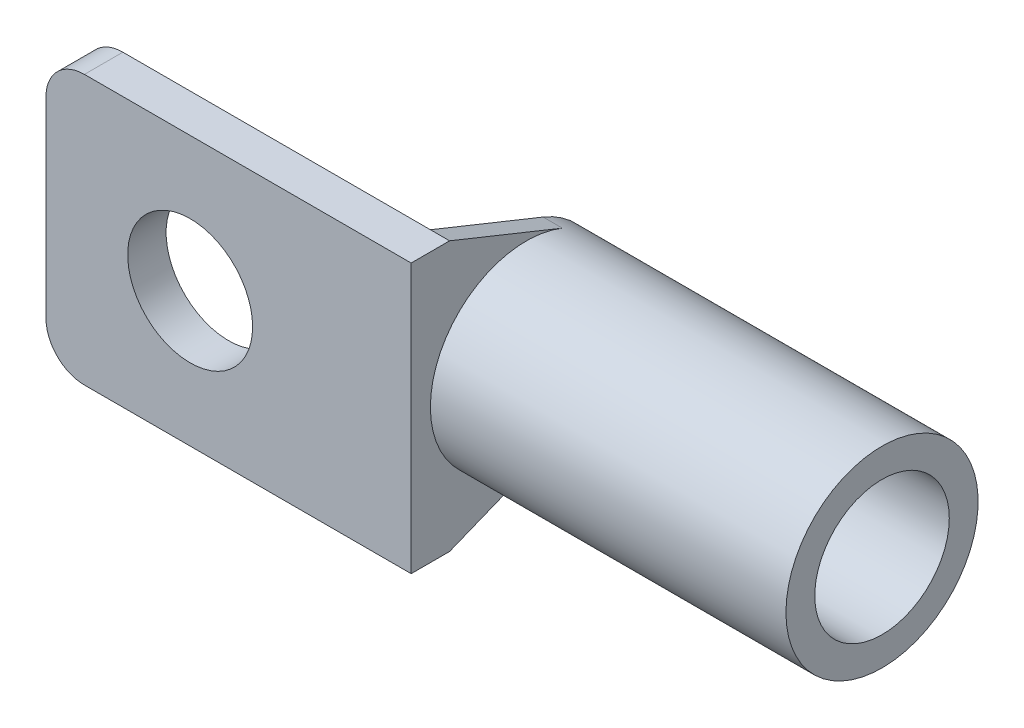
ISO-10303-21;
HEADER;
FILE_DESCRIPTION(('STEP AP214'),'2;1');
FILE_NAME('part.step','',(''),(''),'','','');
FILE_SCHEMA(('AUTOMOTIVE_DESIGN { 1 0 10303 214 1 1 1 1 }'));
ENDSEC;
DATA;
#1=APPLICATION_CONTEXT('core data for automotive mechanical design processes');
#2=APPLICATION_PROTOCOL_DEFINITION('international standard','automotive_design',2000,#1);
#3=PRODUCT_CONTEXT('',#1,'mechanical');
#4=PRODUCT('Part','Part','',(#3));
#5=PRODUCT_RELATED_PRODUCT_CATEGORY('part','',(#4));
#6=PRODUCT_DEFINITION_FORMATION('','',#4);
#7=PRODUCT_DEFINITION_CONTEXT('part definition',#1,'design');
#8=PRODUCT_DEFINITION('design','',#6,#7);
#9=PRODUCT_DEFINITION_SHAPE('','',#8);
#10=(LENGTH_UNIT() NAMED_UNIT(*) SI_UNIT(.MILLI.,.METRE.));
#11=(NAMED_UNIT(*) PLANE_ANGLE_UNIT() SI_UNIT($,.RADIAN.));
#12=(NAMED_UNIT(*) SI_UNIT($,.STERADIAN.) SOLID_ANGLE_UNIT());
#13=UNCERTAINTY_MEASURE_WITH_UNIT(LENGTH_MEASURE(1.E-05),#10,'distance_accuracy_value','');
#14=(GEOMETRIC_REPRESENTATION_CONTEXT(3) GLOBAL_UNCERTAINTY_ASSIGNED_CONTEXT((#13)) GLOBAL_UNIT_ASSIGNED_CONTEXT((#10,
#11,#12)) REPRESENTATION_CONTEXT('',''));
#15=CARTESIAN_POINT('',(0.,0.,0.));
#16=DIRECTION('',(0.,0.,1.));
#17=DIRECTION('',(1.,0.,0.));
#18=AXIS2_PLACEMENT_3D('',#15,#16,#17);
#19=CARTESIAN_POINT('',(0.,0.,-2.));
#20=DIRECTION('',(0.,0.,-1.));
#21=DIRECTION('',(1.,0.,0.));
#22=AXIS2_PLACEMENT_3D('',#19,#20,#21);
#23=PLANE('',#22);
#24=DIRECTION('',(0.,-1.,0.));
#25=VECTOR('',#24,1.);
#26=CARTESIAN_POINT('',(-7.5,7.,-2.));
#27=LINE('',#26,#25);
#28=CARTESIAN_POINT('',(-7.5,5.,-2.));
#29=VERTEX_POINT('',#28);
#30=CARTESIAN_POINT('',(-7.5,-5.,-2.));
#31=VERTEX_POINT('',#30);
#32=EDGE_CURVE('E160',#29,#31,#27,.T.);
#33=ORIENTED_EDGE('',*,*,#32,.F.);
#34=CARTESIAN_POINT('',(-5.5,5.,-2.));
#35=DIRECTION('',(0.,0.,1.));
#36=DIRECTION('',(1.,0.,0.));
#37=AXIS2_PLACEMENT_3D('',#34,#35,#36);
#38=CIRCLE('',#37,2.);
#39=CARTESIAN_POINT('',(-5.5,7.,-2.));
#40=VERTEX_POINT('',#39);
#41=EDGE_CURVE('E214',#40,#29,#38,.T.);
#42=ORIENTED_EDGE('',*,*,#41,.F.);
#43=DIRECTION('',(-1.,0.,0.));
#44=VECTOR('',#43,1.);
#45=CARTESIAN_POINT('',(-7.5,7.,-2.));
#46=LINE('',#45,#44);
#47=CARTESIAN_POINT('',(10.5,7.,-2.));
#48=VERTEX_POINT('',#47);
#49=EDGE_CURVE('E170',#48,#40,#46,.T.);
#50=ORIENTED_EDGE('',*,*,#49,.F.);
#51=DIRECTION('',(-0.680094155203561,-0.733124777959356,0.));
#52=VECTOR('',#51,1.);
#53=CARTESIAN_POINT('',(9.32248316403477,5.73066580221966,-2.));
#54=LINE('',#53,#52);
#55=CARTESIAN_POINT('',(7.5,3.766073760449,-2.));
#56=VERTEX_POINT('',#55);
#57=EDGE_CURVE('E194',#56,#48,#54,.F.);
#58=ORIENTED_EDGE('',*,*,#57,.F.);
#59=DIRECTION('',(0.,1.,0.));
#60=VECTOR('',#59,1.);
#61=CARTESIAN_POINT('',(7.5,7.,-2.));
#62=LINE('',#61,#60);
#63=CARTESIAN_POINT('',(7.5,-3.766073760449,-2.));
#64=VERTEX_POINT('',#63);
#65=EDGE_CURVE('E167',#64,#56,#62,.T.);
#66=ORIENTED_EDGE('',*,*,#65,.F.);
#67=DIRECTION('',(0.680094155203561,-0.733124777959356,0.));
#68=VECTOR('',#67,1.);
#69=CARTESIAN_POINT('',(10.5,-7.,-2.));
#70=LINE('',#69,#68);
#71=CARTESIAN_POINT('',(10.5,-7.,-2.));
#72=VERTEX_POINT('',#71);
#73=EDGE_CURVE('E197',#72,#64,#70,.F.);
#74=ORIENTED_EDGE('',*,*,#73,.F.);
#75=DIRECTION('',(1.,0.,0.));
#76=VECTOR('',#75,1.);
#77=CARTESIAN_POINT('',(-7.5,-7.,-2.));
#78=LINE('',#77,#76);
#79=CARTESIAN_POINT('',(-5.5,-7.,-2.));
#80=VERTEX_POINT('',#79);
#81=EDGE_CURVE('E163',#80,#72,#78,.T.);
#82=ORIENTED_EDGE('',*,*,#81,.F.);
#83=CARTESIAN_POINT('',(-5.5,-5.,-2.));
#84=DIRECTION('',(0.,0.,1.));
#85=DIRECTION('',(1.,0.,0.));
#86=AXIS2_PLACEMENT_3D('',#83,#84,#85);
#87=CIRCLE('',#86,2.);
#88=EDGE_CURVE('E43',#31,#80,#87,.T.);
#89=ORIENTED_EDGE('',*,*,#88,.F.);
#90=EDGE_LOOP('',(#33,#42,#50,#58,#66,#74,#82,#89));
#91=FACE_BOUND('',#90,.T.);
#92=CARTESIAN_POINT('',(0.,0.,-2.));
#93=DIRECTION('',(0.,0.,1.));
#94=DIRECTION('',(1.,0.,0.));
#95=AXIS2_PLACEMENT_3D('',#92,#93,#94);
#96=CIRCLE('',#95,3.25);
#97=CARTESIAN_POINT('',(3.25,0.,-2.));
#98=VERTEX_POINT('',#97);
#99=EDGE_CURVE('E154',#98,#98,#96,.T.);
#100=ORIENTED_EDGE('',*,*,#99,.T.);
#101=EDGE_LOOP('',(#100));
#102=FACE_BOUND('',#101,.T.);
#103=ADVANCED_FACE('F35',(#91,#102),#23,.T.);
#104=CARTESIAN_POINT('',(0.,0.,0.));
#105=DIRECTION('',(0.,0.,-1.));
#106=DIRECTION('',(1.,0.,0.));
#107=AXIS2_PLACEMENT_3D('',#104,#105,#106);
#108=PLANE('',#107);
#109=DIRECTION('',(1.,0.,0.));
#110=VECTOR('',#109,1.);
#111=CARTESIAN_POINT('',(-7.5,-7.,0.));
#112=LINE('',#111,#110);
#113=CARTESIAN_POINT('',(-5.5,-7.,0.));
#114=VERTEX_POINT('',#113);
#115=CARTESIAN_POINT('',(11.5,-7.,0.));
#116=VERTEX_POINT('',#115);
#117=EDGE_CURVE('E175',#114,#116,#112,.T.);
#118=ORIENTED_EDGE('',*,*,#117,.T.);
#119=DIRECTION('',(0.,1.,0.));
#120=VECTOR('',#119,1.);
#121=CARTESIAN_POINT('',(11.5,7.,0.));
#122=LINE('',#121,#120);
#123=CARTESIAN_POINT('',(11.5,7.,0.));
#124=VERTEX_POINT('',#123);
#125=EDGE_CURVE('E233',#116,#124,#122,.T.);
#126=ORIENTED_EDGE('',*,*,#125,.T.);
#127=DIRECTION('',(-1.,0.,0.));
#128=VECTOR('',#127,1.);
#129=CARTESIAN_POINT('',(-7.5,7.,0.));
#130=LINE('',#129,#128);
#131=CARTESIAN_POINT('',(-5.5,7.,0.));
#132=VERTEX_POINT('',#131);
#133=EDGE_CURVE('E164',#124,#132,#130,.T.);
#134=ORIENTED_EDGE('',*,*,#133,.T.);
#135=CARTESIAN_POINT('',(-5.5,5.,0.));
#136=DIRECTION('',(0.,0.,1.));
#137=DIRECTION('',(1.,0.,0.));
#138=AXIS2_PLACEMENT_3D('',#135,#136,#137);
#139=CIRCLE('',#138,2.);
#140=CARTESIAN_POINT('',(-7.5,5.,0.));
#141=VERTEX_POINT('',#140);
#142=EDGE_CURVE('E207',#141,#132,#139,.F.);
#143=ORIENTED_EDGE('',*,*,#142,.F.);
#144=DIRECTION('',(0.,-1.,0.));
#145=VECTOR('',#144,1.);
#146=CARTESIAN_POINT('',(-7.5,7.,0.));
#147=LINE('',#146,#145);
#148=CARTESIAN_POINT('',(-7.5,-5.,0.));
#149=VERTEX_POINT('',#148);
#150=EDGE_CURVE('E157',#141,#149,#147,.T.);
#151=ORIENTED_EDGE('',*,*,#150,.T.);
#152=CARTESIAN_POINT('',(-5.5,-5.,0.));
#153=DIRECTION('',(0.,0.,1.));
#154=DIRECTION('',(1.,0.,0.));
#155=AXIS2_PLACEMENT_3D('',#152,#153,#154);
#156=CIRCLE('',#155,2.);
#157=EDGE_CURVE('E209',#114,#149,#156,.F.);
#158=ORIENTED_EDGE('',*,*,#157,.F.);
#159=EDGE_LOOP('',(#118,#126,#134,#143,#151,#158));
#160=FACE_BOUND('',#159,.T.);
#161=CARTESIAN_POINT('',(0.,0.,0.));
#162=DIRECTION('',(0.,0.,1.));
#163=DIRECTION('',(1.,0.,0.));
#164=AXIS2_PLACEMENT_3D('',#161,#162,#163);
#165=CIRCLE('',#164,3.25);
#166=CARTESIAN_POINT('',(3.25,0.,0.));
#167=VERTEX_POINT('',#166);
#168=EDGE_CURVE('E153',#167,#167,#165,.T.);
#169=ORIENTED_EDGE('',*,*,#168,.F.);
#170=EDGE_LOOP('',(#169));
#171=FACE_BOUND('',#170,.T.);
#172=ADVANCED_FACE('F231',(#160,#171),#108,.F.);
#173=CARTESIAN_POINT('',(-7.5,7.,-2.));
#174=DIRECTION('',(1.,0.,0.));
#175=DIRECTION('',(0.,0.,1.));
#176=AXIS2_PLACEMENT_3D('',#173,#174,#175);
#177=PLANE('',#176);
#178=ORIENTED_EDGE('',*,*,#150,.F.);
#179=DIRECTION('',(0.,0.,1.));
#180=VECTOR('',#179,1.);
#181=CARTESIAN_POINT('',(-7.5,5.,-2.));
#182=LINE('',#181,#180);
#183=EDGE_CURVE('E211',#29,#141,#182,.T.);
#184=ORIENTED_EDGE('',*,*,#183,.F.);
#185=ORIENTED_EDGE('',*,*,#32,.T.);
#186=DIRECTION('',(0.,0.,1.));
#187=VECTOR('',#186,1.);
#188=CARTESIAN_POINT('',(-7.5,-5.,-2.));
#189=LINE('',#188,#187);
#190=EDGE_CURVE('E56',#149,#31,#189,.F.);
#191=ORIENTED_EDGE('',*,*,#190,.F.);
#192=EDGE_LOOP('',(#178,#184,#185,#191));
#193=FACE_BOUND('',#192,.T.);
#194=ADVANCED_FACE('F237',(#193),#177,.F.);
#195=CARTESIAN_POINT('',(-7.5,-7.,-2.));
#196=DIRECTION('',(0.,1.,0.));
#197=DIRECTION('',(0.,0.,-1.));
#198=AXIS2_PLACEMENT_3D('',#195,#196,#197);
#199=PLANE('',#198);
#200=ORIENTED_EDGE('',*,*,#81,.T.);
#201=DIRECTION('',(-1.,0.,0.));
#202=VECTOR('',#201,1.);
#203=CARTESIAN_POINT('',(11.5,-7.,-2.));
#204=LINE('',#203,#202);
#205=CARTESIAN_POINT('',(11.5,-7.,-2.));
#206=VERTEX_POINT('',#205);
#207=EDGE_CURVE('E145',#206,#72,#204,.T.);
#208=ORIENTED_EDGE('',*,*,#207,.F.);
#209=DIRECTION('',(0.,0.,1.));
#210=VECTOR('',#209,1.);
#211=CARTESIAN_POINT('',(11.5,-7.,0.));
#212=LINE('',#211,#210);
#213=EDGE_CURVE('E227',#206,#116,#212,.T.);
#214=ORIENTED_EDGE('',*,*,#213,.T.);
#215=ORIENTED_EDGE('',*,*,#117,.F.);
#216=DIRECTION('',(0.,0.,1.));
#217=VECTOR('',#216,1.);
#218=CARTESIAN_POINT('',(-5.5,-7.,-2.));
#219=LINE('',#218,#217);
#220=EDGE_CURVE('E200',#80,#114,#219,.T.);
#221=ORIENTED_EDGE('',*,*,#220,.F.);
#222=EDGE_LOOP('',(#200,#208,#214,#215,#221));
#223=FACE_BOUND('',#222,.T.);
#224=ADVANCED_FACE('F225',(#223),#199,.F.);
#225=CARTESIAN_POINT('',(-7.5,7.,-2.));
#226=DIRECTION('',(0.,-1.,0.));
#227=DIRECTION('',(0.,0.,1.));
#228=AXIS2_PLACEMENT_3D('',#225,#226,#227);
#229=PLANE('',#228);
#230=ORIENTED_EDGE('',*,*,#133,.F.);
#231=DIRECTION('',(0.,0.,-1.));
#232=VECTOR('',#231,1.);
#233=CARTESIAN_POINT('',(11.5,7.,-2.));
#234=LINE('',#233,#232);
#235=CARTESIAN_POINT('',(11.5,7.,-2.));
#236=VERTEX_POINT('',#235);
#237=EDGE_CURVE('E127',#124,#236,#234,.T.);
#238=ORIENTED_EDGE('',*,*,#237,.T.);
#239=DIRECTION('',(-1.,0.,0.));
#240=VECTOR('',#239,1.);
#241=CARTESIAN_POINT('',(11.5,7.,-2.));
#242=LINE('',#241,#240);
#243=EDGE_CURVE('E124',#236,#48,#242,.T.);
#244=ORIENTED_EDGE('',*,*,#243,.T.);
#245=ORIENTED_EDGE('',*,*,#49,.T.);
#246=DIRECTION('',(0.,0.,1.));
#247=VECTOR('',#246,1.);
#248=CARTESIAN_POINT('',(-5.5,7.,-2.));
#249=LINE('',#248,#247);
#250=EDGE_CURVE('E11',#132,#40,#249,.F.);
#251=ORIENTED_EDGE('',*,*,#250,.F.);
#252=EDGE_LOOP('',(#230,#238,#244,#245,#251));
#253=FACE_BOUND('',#252,.T.);
#254=ADVANCED_FACE('F243',(#253),#229,.F.);
#255=CARTESIAN_POINT('',(0.,0.,-2.));
#256=DIRECTION('',(0.,0.,1.));
#257=DIRECTION('',(-1.,0.,0.));
#258=AXIS2_PLACEMENT_3D('',#255,#256,#257);
#259=CYLINDRICAL_SURFACE('',#258,3.25);
#260=ORIENTED_EDGE('',*,*,#99,.F.);
#261=EDGE_LOOP('',(#260));
#262=FACE_BOUND('',#261,.T.);
#263=ORIENTED_EDGE('',*,*,#168,.T.);
#264=EDGE_LOOP('',(#263));
#265=FACE_BOUND('',#264,.T.);
#266=ADVANCED_FACE('F289',(#262,#265),#259,.F.);
#267=CARTESIAN_POINT('',(11.5,0.,-6.));
#268=DIRECTION('',(-1.,0.,0.));
#269=DIRECTION('',(0.,0.,-1.));
#270=AXIS2_PLACEMENT_3D('',#267,#268,#269);
#271=CYLINDRICAL_SURFACE('',#270,5.);
#272=DIRECTION('',(-1.,0.,0.));
#273=VECTOR('',#272,1.);
#274=CARTESIAN_POINT('',(11.5,4.63832471394977,-7.8670682494121));
#275=LINE('',#274,#273);
#276=CARTESIAN_POINT('',(11.5,4.63832471394977,-7.8670682494121));
#277=VERTEX_POINT('',#276);
#278=CARTESIAN_POINT('',(10.5,4.63832471394977,-7.8670682494121));
#279=VERTEX_POINT('',#278);
#280=EDGE_CURVE('E122',#277,#279,#275,.T.);
#281=ORIENTED_EDGE('',*,*,#280,.F.);
#282=CARTESIAN_POINT('',(11.5,0.,-6.));
#283=DIRECTION('',(-1.,0.,0.));
#284=DIRECTION('',(0.,0.,1.));
#285=AXIS2_PLACEMENT_3D('',#282,#283,#284);
#286=CIRCLE('',#285,5.);
#287=CARTESIAN_POINT('',(11.5,-4.63832471394977,-7.8670682494121));
#288=VERTEX_POINT('',#287);
#289=EDGE_CURVE('E130',#277,#288,#286,.F.);
#290=ORIENTED_EDGE('',*,*,#289,.T.);
#291=DIRECTION('',(-1.,0.,0.));
#292=VECTOR('',#291,1.);
#293=CARTESIAN_POINT('',(11.5,-4.63832471394977,-7.8670682494121));
#294=LINE('',#293,#292);
#295=CARTESIAN_POINT('',(10.5,-4.63832471394977,-7.8670682494121));
#296=VERTEX_POINT('',#295);
#297=EDGE_CURVE('E151',#288,#296,#294,.T.);
#298=ORIENTED_EDGE('',*,*,#297,.T.);
#299=CARTESIAN_POINT('',(10.5,0.,-6.));
#300=DIRECTION('',(-1.,0.,0.));
#301=DIRECTION('',(0.,0.,1.));
#302=AXIS2_PLACEMENT_3D('',#299,#300,#301);
#303=CIRCLE('',#302,5.);
#304=EDGE_CURVE('E143',#279,#296,#303,.T.);
#305=ORIENTED_EDGE('',*,*,#304,.F.);
#306=EDGE_LOOP('',(#281,#290,#298,#305));
#307=FACE_BOUND('',#306,.T.);
#308=CARTESIAN_POINT('',(30.,0.,-6.));
#309=DIRECTION('',(-1.,0.,0.));
#310=DIRECTION('',(0.,0.,1.));
#311=AXIS2_PLACEMENT_3D('',#308,#309,#310);
#312=CIRCLE('',#311,5.);
#313=CARTESIAN_POINT('',(30.,0.,-1.));
#314=VERTEX_POINT('',#313);
#315=EDGE_CURVE('E137',#314,#314,#312,.T.);
#316=ORIENTED_EDGE('',*,*,#315,.T.);
#317=EDGE_LOOP('',(#316));
#318=FACE_BOUND('',#317,.T.);
#319=ADVANCED_FACE('F140',(#307,#318),#271,.T.);
#320=CARTESIAN_POINT('',(11.5,-7.,-2.));
#321=DIRECTION('',(0.,0.927664942789954,0.37341364988242));
#322=DIRECTION('',(0.,0.37341364988242,-0.927664942789954));
#323=AXIS2_PLACEMENT_3D('',#320,#321,#322);
#324=PLANE('',#323);
#325=ORIENTED_EDGE('',*,*,#297,.F.);
#326=DIRECTION('',(0.,-0.37341364988242,0.927664942789954));
#327=VECTOR('',#326,1.);
#328=CARTESIAN_POINT('',(11.5,-7.,-2.));
#329=LINE('',#328,#327);
#330=EDGE_CURVE('E133',#288,#206,#329,.T.);
#331=ORIENTED_EDGE('',*,*,#330,.T.);
#332=ORIENTED_EDGE('',*,*,#207,.T.);
#333=DIRECTION('',(0.,-0.37341364988242,0.927664942789954));
#334=VECTOR('',#333,1.);
#335=CARTESIAN_POINT('',(10.5,-7.,-2.));
#336=LINE('',#335,#334);
#337=EDGE_CURVE('E191',#296,#72,#336,.T.);
#338=ORIENTED_EDGE('',*,*,#337,.F.);
#339=EDGE_LOOP('',(#325,#331,#332,#338));
#340=FACE_BOUND('',#339,.T.);
#341=ADVANCED_FACE('F254',(#340),#324,.F.);
#342=CARTESIAN_POINT('',(11.5,4.63832471394977,-7.8670682494121));
#343=DIRECTION('',(0.,-0.927664942789954,0.37341364988242));
#344=DIRECTION('',(0.,0.37341364988242,0.927664942789954));
#345=AXIS2_PLACEMENT_3D('',#342,#343,#344);
#346=PLANE('',#345);
#347=ORIENTED_EDGE('',*,*,#243,.F.);
#348=DIRECTION('',(0.,-0.37341364988242,-0.927664942789954));
#349=VECTOR('',#348,1.);
#350=CARTESIAN_POINT('',(11.5,4.63832471394977,-7.8670682494121));
#351=LINE('',#350,#349);
#352=EDGE_CURVE('E118',#236,#277,#351,.T.);
#353=ORIENTED_EDGE('',*,*,#352,.T.);
#354=ORIENTED_EDGE('',*,*,#280,.T.);
#355=DIRECTION('',(0.,-0.37341364988242,-0.927664942789954));
#356=VECTOR('',#355,1.);
#357=CARTESIAN_POINT('',(10.5,4.63832471394977,-7.8670682494121));
#358=LINE('',#357,#356);
#359=EDGE_CURVE('E180',#48,#279,#358,.T.);
#360=ORIENTED_EDGE('',*,*,#359,.F.);
#361=EDGE_LOOP('',(#347,#353,#354,#360));
#362=FACE_BOUND('',#361,.T.);
#363=ADVANCED_FACE('F120',(#362),#346,.F.);
#364=CARTESIAN_POINT('',(11.5,0.,-6.));
#365=DIRECTION('',(1.,0.,0.));
#366=DIRECTION('',(0.,0.,1.));
#367=AXIS2_PLACEMENT_3D('',#364,#365,#366);
#368=PLANE('',#367);
#369=ORIENTED_EDGE('',*,*,#352,.F.);
#370=ORIENTED_EDGE('',*,*,#237,.F.);
#371=ORIENTED_EDGE('',*,*,#125,.F.);
#372=ORIENTED_EDGE('',*,*,#213,.F.);
#373=ORIENTED_EDGE('',*,*,#330,.F.);
#374=ORIENTED_EDGE('',*,*,#289,.F.);
#375=EDGE_LOOP('',(#369,#370,#371,#372,#373,#374));
#376=FACE_BOUND('',#375,.T.);
#377=ADVANCED_FACE('F131',(#376),#368,.T.);
#378=CARTESIAN_POINT('',(7.5,0.,-6.));
#379=DIRECTION('',(1.,0.,0.));
#380=DIRECTION('',(0.,0.,1.));
#381=AXIS2_PLACEMENT_3D('',#378,#379,#380);
#382=PLANE('',#381);
#383=CARTESIAN_POINT('',(7.5,0.,-6.));
#384=DIRECTION('',(-1.,0.,0.));
#385=DIRECTION('',(0.,0.,1.));
#386=AXIS2_PLACEMENT_3D('',#383,#384,#385);
#387=CIRCLE('',#386,1.99999999999999);
#388=CARTESIAN_POINT('',(7.5,-1.8553298855799,-6.74682729976484));
#389=VERTEX_POINT('',#388);
#390=CARTESIAN_POINT('',(7.5,1.8553298855799,-6.74682729976484));
#391=VERTEX_POINT('',#390);
#392=EDGE_CURVE('E183',#389,#391,#387,.F.);
#393=ORIENTED_EDGE('',*,*,#392,.F.);
#394=DIRECTION('',(0.,0.37341364988242,-0.927664942789954));
#395=VECTOR('',#394,1.);
#396=CARTESIAN_POINT('',(7.5,-1.8553298855799,-6.74682729976484));
#397=LINE('',#396,#395);
#398=EDGE_CURVE('E186',#64,#389,#397,.T.);
#399=ORIENTED_EDGE('',*,*,#398,.F.);
#400=ORIENTED_EDGE('',*,*,#65,.T.);
#401=DIRECTION('',(0.,0.37341364988242,0.927664942789954));
#402=VECTOR('',#401,1.);
#403=CARTESIAN_POINT('',(7.5,1.8553298855799,-6.74682729976484));
#404=LINE('',#403,#402);
#405=EDGE_CURVE('E189',#391,#56,#404,.T.);
#406=ORIENTED_EDGE('',*,*,#405,.F.);
#407=EDGE_LOOP('',(#393,#399,#400,#406));
#408=FACE_BOUND('',#407,.T.);
#409=ADVANCED_FACE('F249',(#408),#382,.F.);
#410=CARTESIAN_POINT('',(30.,0.,-6.));
#411=DIRECTION('',(1.,0.,0.));
#412=DIRECTION('',(0.,0.,1.));
#413=AXIS2_PLACEMENT_3D('',#410,#411,#412);
#414=PLANE('',#413);
#415=ORIENTED_EDGE('',*,*,#315,.F.);
#416=EDGE_LOOP('',(#415));
#417=FACE_BOUND('',#416,.T.);
#418=CARTESIAN_POINT('',(30.,0.,-6.));
#419=DIRECTION('',(-1.,0.,0.));
#420=DIRECTION('',(0.,0.,1.));
#421=AXIS2_PLACEMENT_3D('',#418,#419,#420);
#422=CIRCLE('',#421,3.5);
#423=CARTESIAN_POINT('',(30.,0.,-9.5));
#424=VERTEX_POINT('',#423);
#425=EDGE_CURVE('E205',#424,#424,#422,.T.);
#426=ORIENTED_EDGE('',*,*,#425,.T.);
#427=EDGE_LOOP('',(#426));
#428=FACE_BOUND('',#427,.T.);
#429=ADVANCED_FACE('F266',(#417,#428),#414,.T.);
#430=CARTESIAN_POINT('',(30.,0.,-6.));
#431=DIRECTION('',(-1.,0.,0.));
#432=DIRECTION('',(0.,0.,-1.));
#433=AXIS2_PLACEMENT_3D('',#430,#431,#432);
#434=CYLINDRICAL_SURFACE('',#433,3.5);
#435=CARTESIAN_POINT('',(11.5,0.,-6.));
#436=DIRECTION('',(-1.,0.,0.));
#437=DIRECTION('',(0.,0.,1.));
#438=AXIS2_PLACEMENT_3D('',#435,#436,#437);
#439=CIRCLE('',#438,3.5);
#440=CARTESIAN_POINT('',(11.5,0.,-9.5));
#441=VERTEX_POINT('',#440);
#442=EDGE_CURVE('E172',#441,#441,#439,.F.);
#443=CARTESIAN_POINT('',(11.5,0.,-9.5));
#444=CARTESIAN_POINT('',(11.6927083333333,0.,-9.5));
#445=CARTESIAN_POINT('',(11.8854166666667,0.,-9.5));
#446=CARTESIAN_POINT('',(12.2708333333333,0.,-9.5));
#447=CARTESIAN_POINT('',(12.4635416666667,0.,-9.5));
#448=CARTESIAN_POINT('',(12.8489583333333,0.,-9.5));
#449=CARTESIAN_POINT('',(13.0416666666667,0.,-9.5));
#450=CARTESIAN_POINT('',(13.4270833333333,0.,-9.5));
#451=CARTESIAN_POINT('',(13.6197916666667,0.,-9.5));
#452=CARTESIAN_POINT('',(14.0052083333333,0.,-9.5));
#453=CARTESIAN_POINT('',(14.1979166666667,0.,-9.5));
#454=CARTESIAN_POINT('',(14.5833333333333,0.,-9.5));
#455=CARTESIAN_POINT('',(14.7760416666667,0.,-9.5));
#456=CARTESIAN_POINT('',(15.1614583333333,0.,-9.5));
#457=CARTESIAN_POINT('',(15.3541666666667,0.,-9.5));
#458=CARTESIAN_POINT('',(15.7395833333333,0.,-9.5));
#459=CARTESIAN_POINT('',(15.9322916666667,0.,-9.5));
#460=CARTESIAN_POINT('',(16.3177083333333,0.,-9.5));
#461=CARTESIAN_POINT('',(16.5104166666667,0.,-9.5));
#462=CARTESIAN_POINT('',(16.8958333333333,0.,-9.5));
#463=CARTESIAN_POINT('',(17.0885416666667,0.,-9.5));
#464=CARTESIAN_POINT('',(17.4739583333333,0.,-9.5));
#465=CARTESIAN_POINT('',(17.6666666666667,0.,-9.5));
#466=CARTESIAN_POINT('',(18.0520833333333,0.,-9.5));
#467=CARTESIAN_POINT('',(18.2447916666667,0.,-9.5));
#468=CARTESIAN_POINT('',(18.6302083333333,0.,-9.5));
#469=CARTESIAN_POINT('',(18.8229166666667,0.,-9.5));
#470=CARTESIAN_POINT('',(19.2083333333333,0.,-9.5));
#471=CARTESIAN_POINT('',(19.4010416666667,0.,-9.5));
#472=CARTESIAN_POINT('',(19.7864583333333,0.,-9.5));
#473=CARTESIAN_POINT('',(19.9791666666667,0.,-9.5));
#474=CARTESIAN_POINT('',(20.3645833333333,0.,-9.5));
#475=CARTESIAN_POINT('',(20.5572916666667,0.,-9.5));
#476=CARTESIAN_POINT('',(20.9427083333333,0.,-9.5));
#477=CARTESIAN_POINT('',(21.1354166666667,0.,-9.5));
#478=CARTESIAN_POINT('',(21.5208333333333,0.,-9.5));
#479=CARTESIAN_POINT('',(21.7135416666667,0.,-9.5));
#480=CARTESIAN_POINT('',(22.0989583333333,0.,-9.5));
#481=CARTESIAN_POINT('',(22.2916666666667,0.,-9.5));
#482=CARTESIAN_POINT('',(22.6770833333333,0.,-9.5));
#483=CARTESIAN_POINT('',(22.8697916666667,0.,-9.5));
#484=CARTESIAN_POINT('',(23.2552083333333,0.,-9.5));
#485=CARTESIAN_POINT('',(23.4479166666667,0.,-9.5));
#486=CARTESIAN_POINT('',(23.8333333333333,0.,-9.5));
#487=CARTESIAN_POINT('',(24.0260416666667,0.,-9.5));
#488=CARTESIAN_POINT('',(24.4114583333333,0.,-9.5));
#489=CARTESIAN_POINT('',(24.6041666666667,0.,-9.5));
#490=CARTESIAN_POINT('',(24.9895833333333,0.,-9.5));
#491=CARTESIAN_POINT('',(25.1822916666667,0.,-9.5));
#492=CARTESIAN_POINT('',(25.5677083333333,0.,-9.5));
#493=CARTESIAN_POINT('',(25.7604166666667,0.,-9.5));
#494=CARTESIAN_POINT('',(26.1458333333333,0.,-9.5));
#495=CARTESIAN_POINT('',(26.3385416666667,0.,-9.5));
#496=CARTESIAN_POINT('',(26.7239583333333,0.,-9.5));
#497=CARTESIAN_POINT('',(26.9166666666667,0.,-9.5));
#498=CARTESIAN_POINT('',(27.3020833333333,0.,-9.5));
#499=CARTESIAN_POINT('',(27.4947916666667,0.,-9.5));
#500=CARTESIAN_POINT('',(27.8802083333333,0.,-9.5));
#501=CARTESIAN_POINT('',(28.0729166666667,0.,-9.5));
#502=CARTESIAN_POINT('',(28.4583333333333,0.,-9.5));
#503=CARTESIAN_POINT('',(28.6510416666667,0.,-9.5));
#504=CARTESIAN_POINT('',(29.0364583333333,0.,-9.5));
#505=CARTESIAN_POINT('',(29.2291666666667,0.,-9.5));
#506=CARTESIAN_POINT('',(29.6145833333333,0.,-9.5));
#507=CARTESIAN_POINT('',(29.8072916666667,0.,-9.5));
#508=CARTESIAN_POINT('',(30.,0.,-9.5));
#509=B_SPLINE_CURVE_WITH_KNOTS('',3,(#443,#444,#445,#446,#447,#448,#449,#450,#451,#452,#453,
#454,#455,#456,#457,#458,#459,#460,#461,#462,#463,#464,#465,#466,#467,#468,#469,#470,#471,#472,
#473,#474,#475,#476,#477,#478,#479,#480,#481,#482,#483,#484,#485,#486,#487,#488,#489,#490,#491,
#492,#493,#494,#495,#496,#497,#498,#499,#500,#501,#502,#503,#504,#505,#506,#507,#508),
.UNSPECIFIED.,.F.,.F.,(4,2,2,2,2,2,2,2,2,2,2,2,2,2,2,2,2,2,2,2,2,2,2,2,2,2,2,2,2,2,2,2,4),(0.,
0.578124999999999,1.15625,1.734375,2.3125,2.890625,3.46875,4.046875,4.625,5.203125,5.78125,
6.359375,6.9375,7.515625,8.09375,8.671875,9.25,9.828125,10.40625,10.984375,11.5625,12.140625,
12.71875,13.296875,13.875,14.453125,15.03125,15.609375,16.1875,16.765625,17.34375,17.921875,
18.5),.UNSPECIFIED.);
#510=EDGE_CURVE('BSEAM268',#441,#424,#509,.T.);
#511=ORIENTED_EDGE('',*,*,#442,.F.);
#512=ORIENTED_EDGE('',*,*,#425,.F.);
#513=ORIENTED_EDGE('',*,*,#510,.T.);
#514=ORIENTED_EDGE('',*,*,#510,.F.);
#515=EDGE_LOOP('',(#511,#513,#512,#514));
#516=FACE_BOUND('',#515,.T.);
#517=ADVANCED_FACE('F268',(#516),#434,.F.);
#518=ORIENTED_EDGE('',*,*,#442,.T.);
#519=EDGE_LOOP('',(#518));
#520=FACE_BOUND('',#519,.T.);
#521=ADVANCED_FACE('F270',(#520),#368,.T.);
#522=CARTESIAN_POINT('',(10.5,-7.,-2.));
#523=DIRECTION('',(0.707106781186549,0.655958171715806,0.264043324019478));
#524=DIRECTION('',(0.,-0.37341364988242,0.927664942789954));
#525=AXIS2_PLACEMENT_3D('',#522,#523,#524);
#526=PLANE('',#525);
#527=ORIENTED_EDGE('',*,*,#73,.T.);
#528=ORIENTED_EDGE('',*,*,#398,.T.);
#529=DIRECTION('',(0.707106781186546,-0.655958171715809,-0.264043324019479));
#530=VECTOR('',#529,1.);
#531=CARTESIAN_POINT('',(7.5,-1.8553298855799,-6.74682729976484));
#532=LINE('',#531,#530);
#533=EDGE_CURVE('E203',#389,#296,#532,.T.);
#534=ORIENTED_EDGE('',*,*,#533,.T.);
#535=ORIENTED_EDGE('',*,*,#337,.T.);
#536=EDGE_LOOP('',(#527,#528,#534,#535));
#537=FACE_BOUND('',#536,.T.);
#538=ADVANCED_FACE('F251',(#537),#526,.F.);
#539=CARTESIAN_POINT('',(10.5,0.,-6.));
#540=DIRECTION('',(1.,0.,0.));
#541=DIRECTION('',(0.,0.,1.));
#542=AXIS2_PLACEMENT_3D('',#539,#540,#541);
#543=CONICAL_SURFACE('',#542,5.,0.78539816339745);
#544=ORIENTED_EDGE('',*,*,#533,.F.);
#545=ORIENTED_EDGE('',*,*,#392,.T.);
#546=DIRECTION('',(0.707106781186546,0.655958171715809,-0.264043324019479));
#547=VECTOR('',#546,1.);
#548=CARTESIAN_POINT('',(7.5,1.8553298855799,-6.74682729976484));
#549=LINE('',#548,#547);
#550=EDGE_CURVE('E201',#391,#279,#549,.T.);
#551=ORIENTED_EDGE('',*,*,#550,.T.);
#552=ORIENTED_EDGE('',*,*,#304,.T.);
#553=EDGE_LOOP('',(#544,#545,#551,#552));
#554=FACE_BOUND('',#553,.T.);
#555=ADVANCED_FACE('F300',(#554),#543,.T.);
#556=CARTESIAN_POINT('',(10.5,4.63832471394977,-7.8670682494121));
#557=DIRECTION('',(0.707106781186549,-0.655958171715806,0.264043324019478));
#558=DIRECTION('',(0.,-0.37341364988242,-0.927664942789954));
#559=AXIS2_PLACEMENT_3D('',#556,#557,#558);
#560=PLANE('',#559);
#561=ORIENTED_EDGE('',*,*,#57,.T.);
#562=ORIENTED_EDGE('',*,*,#359,.T.);
#563=ORIENTED_EDGE('',*,*,#550,.F.);
#564=ORIENTED_EDGE('',*,*,#405,.T.);
#565=EDGE_LOOP('',(#561,#562,#563,#564));
#566=FACE_BOUND('',#565,.T.);
#567=ADVANCED_FACE('F245',(#566),#560,.F.);
#568=CARTESIAN_POINT('',(-5.5,-5.,-2.));
#569=DIRECTION('',(0.,0.,1.));
#570=DIRECTION('',(-1.,0.,0.));
#571=AXIS2_PLACEMENT_3D('',#568,#569,#570);
#572=CYLINDRICAL_SURFACE('',#571,2.);
#573=ORIENTED_EDGE('',*,*,#88,.T.);
#574=ORIENTED_EDGE('',*,*,#220,.T.);
#575=ORIENTED_EDGE('',*,*,#157,.T.);
#576=ORIENTED_EDGE('',*,*,#190,.T.);
#577=EDGE_LOOP('',(#573,#574,#575,#576));
#578=FACE_BOUND('',#577,.T.);
#579=ADVANCED_FACE('F216',(#578),#572,.T.);
#580=CARTESIAN_POINT('',(-5.5,5.,-2.));
#581=DIRECTION('',(0.,0.,1.));
#582=DIRECTION('',(-1.,0.,0.));
#583=AXIS2_PLACEMENT_3D('',#580,#581,#582);
#584=CYLINDRICAL_SURFACE('',#583,2.);
#585=ORIENTED_EDGE('',*,*,#41,.T.);
#586=ORIENTED_EDGE('',*,*,#183,.T.);
#587=ORIENTED_EDGE('',*,*,#142,.T.);
#588=ORIENTED_EDGE('',*,*,#250,.T.);
#589=EDGE_LOOP('',(#585,#586,#587,#588));
#590=FACE_BOUND('',#589,.T.);
#591=ADVANCED_FACE('F37',(#590),#584,.T.);
#592=CLOSED_SHELL('',(#103,#172,#194,#224,#254,#266,#319,#341,#363,#377,#409,#429,#517,#521,
#538,#555,#567,#579,#591));
#593=MANIFOLD_SOLID_BREP('B2',#592);
#594=ADVANCED_BREP_SHAPE_REPRESENTATION('',(#18,#593),#14);
#595=SHAPE_DEFINITION_REPRESENTATION(#9,#594);
ENDSEC;
END-ISO-10303-21;
